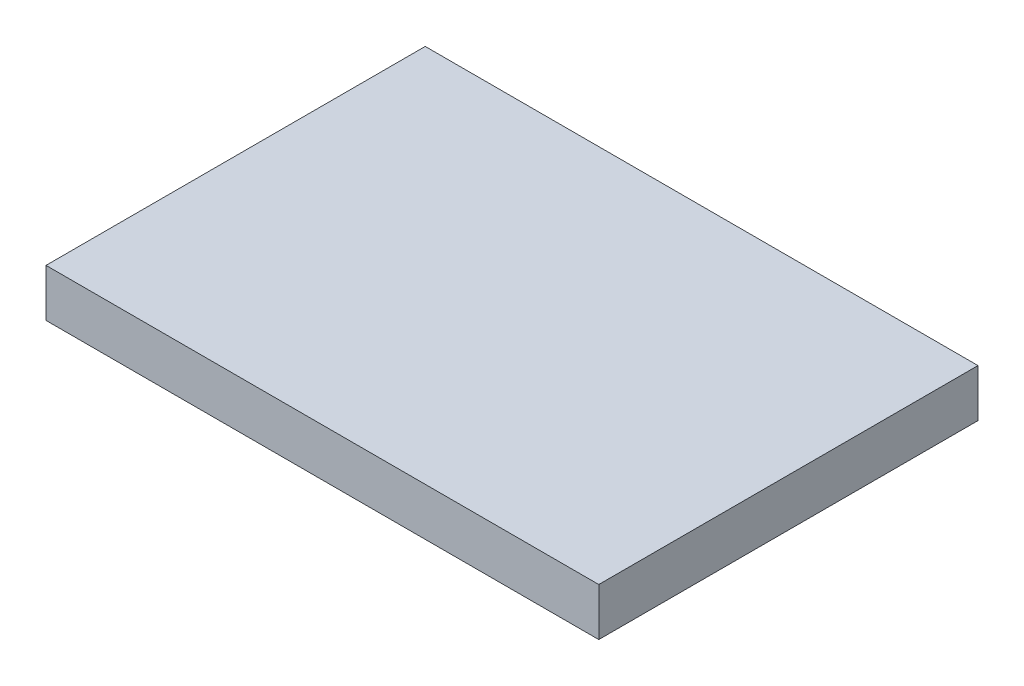
ISO-10303-21;
HEADER;
FILE_DESCRIPTION(('STEP AP214'),'2;1');
FILE_NAME('part.step','',(''),(''),'','','');
FILE_SCHEMA(('AUTOMOTIVE_DESIGN { 1 0 10303 214 1 1 1 1 }'));
ENDSEC;
DATA;
#1=APPLICATION_CONTEXT('core data for automotive mechanical design processes');
#2=APPLICATION_PROTOCOL_DEFINITION('international standard','automotive_design',2000,#1);
#3=PRODUCT_CONTEXT('',#1,'mechanical');
#4=PRODUCT('Part','Part','',(#3));
#5=PRODUCT_RELATED_PRODUCT_CATEGORY('part','',(#4));
#6=PRODUCT_DEFINITION_FORMATION('','',#4);
#7=PRODUCT_DEFINITION_CONTEXT('part definition',#1,'design');
#8=PRODUCT_DEFINITION('design','',#6,#7);
#9=PRODUCT_DEFINITION_SHAPE('','',#8);
#10=(LENGTH_UNIT() NAMED_UNIT(*) SI_UNIT(.MILLI.,.METRE.));
#11=(NAMED_UNIT(*) PLANE_ANGLE_UNIT() SI_UNIT($,.RADIAN.));
#12=(NAMED_UNIT(*) SI_UNIT($,.STERADIAN.) SOLID_ANGLE_UNIT());
#13=UNCERTAINTY_MEASURE_WITH_UNIT(LENGTH_MEASURE(1.E-05),#10,'distance_accuracy_value','');
#14=(GEOMETRIC_REPRESENTATION_CONTEXT(3) GLOBAL_UNCERTAINTY_ASSIGNED_CONTEXT((#13)) GLOBAL_UNIT_ASSIGNED_CONTEXT((#10,
#11,#12)) REPRESENTATION_CONTEXT('',''));
#15=CARTESIAN_POINT('',(0.,0.,0.));
#16=DIRECTION('',(0.,0.,1.));
#17=DIRECTION('',(1.,0.,0.));
#18=AXIS2_PLACEMENT_3D('',#15,#16,#17);
#19=CARTESIAN_POINT('',(0.,12.7,0.));
#20=DIRECTION('',(1.,0.,0.));
#21=DIRECTION('',(0.,0.,-1.));
#22=AXIS2_PLACEMENT_3D('',#19,#20,#21);
#23=PLANE('',#22);
#24=DIRECTION('',(0.,0.,1.));
#25=VECTOR('',#24,1.);
#26=CARTESIAN_POINT('',(0.,0.,0.));
#27=LINE('',#26,#25);
#28=CARTESIAN_POINT('',(0.,0.,-100.979479207466));
#29=VERTEX_POINT('',#28);
#30=CARTESIAN_POINT('',(0.,0.,0.));
#31=VERTEX_POINT('',#30);
#32=EDGE_CURVE('E94',#29,#31,#27,.T.);
#33=ORIENTED_EDGE('',*,*,#32,.T.);
#34=DIRECTION('',(0.,-1.,0.));
#35=VECTOR('',#34,1.);
#36=CARTESIAN_POINT('',(0.,12.7,0.));
#37=LINE('',#36,#35);
#38=CARTESIAN_POINT('',(0.,12.7,0.));
#39=VERTEX_POINT('',#38);
#40=EDGE_CURVE('E11',#39,#31,#37,.T.);
#41=ORIENTED_EDGE('',*,*,#40,.F.);
#42=DIRECTION('',(0.,0.,1.));
#43=VECTOR('',#42,1.);
#44=CARTESIAN_POINT('',(0.,12.7,0.));
#45=LINE('',#44,#43);
#46=CARTESIAN_POINT('',(0.,12.7,-100.979479207466));
#47=VERTEX_POINT('',#46);
#48=EDGE_CURVE('E82',#47,#39,#45,.T.);
#49=ORIENTED_EDGE('',*,*,#48,.F.);
#50=DIRECTION('',(0.,-1.,0.));
#51=VECTOR('',#50,1.);
#52=CARTESIAN_POINT('',(0.,12.7,-100.979479207466));
#53=LINE('',#52,#51);
#54=EDGE_CURVE('E90',#47,#29,#53,.T.);
#55=ORIENTED_EDGE('',*,*,#54,.T.);
#56=EDGE_LOOP('',(#33,#41,#49,#55));
#57=FACE_BOUND('',#56,.T.);
#58=ADVANCED_FACE('F31',(#57),#23,.F.);
#59=CARTESIAN_POINT('',(0.,12.7,0.));
#60=DIRECTION('',(0.,0.,-1.));
#61=DIRECTION('',(-1.,0.,0.));
#62=AXIS2_PLACEMENT_3D('',#59,#60,#61);
#63=PLANE('',#62);
#64=DIRECTION('',(1.,0.,0.));
#65=VECTOR('',#64,1.);
#66=CARTESIAN_POINT('',(0.,0.,0.));
#67=LINE('',#66,#65);
#68=CARTESIAN_POINT('',(147.191865543677,0.,0.));
#69=VERTEX_POINT('',#68);
#70=EDGE_CURVE('E86',#31,#69,#67,.T.);
#71=ORIENTED_EDGE('',*,*,#70,.T.);
#72=DIRECTION('',(0.,-1.,0.));
#73=VECTOR('',#72,1.);
#74=CARTESIAN_POINT('',(147.191865543677,12.7,0.));
#75=LINE('',#74,#73);
#76=CARTESIAN_POINT('',(147.191865543677,12.7,0.));
#77=VERTEX_POINT('',#76);
#78=EDGE_CURVE('E39',#77,#69,#75,.T.);
#79=ORIENTED_EDGE('',*,*,#78,.F.);
#80=DIRECTION('',(1.,0.,0.));
#81=VECTOR('',#80,1.);
#82=CARTESIAN_POINT('',(0.,12.7,0.));
#83=LINE('',#82,#81);
#84=EDGE_CURVE('E77',#39,#77,#83,.T.);
#85=ORIENTED_EDGE('',*,*,#84,.F.);
#86=ORIENTED_EDGE('',*,*,#40,.T.);
#87=EDGE_LOOP('',(#71,#79,#85,#86));
#88=FACE_BOUND('',#87,.T.);
#89=ADVANCED_FACE('F85',(#88),#63,.F.);
#90=CARTESIAN_POINT('',(147.191865543677,12.7,0.));
#91=DIRECTION('',(-1.,0.,0.));
#92=DIRECTION('',(0.,0.,1.));
#93=AXIS2_PLACEMENT_3D('',#90,#91,#92);
#94=PLANE('',#93);
#95=DIRECTION('',(0.,0.,-1.));
#96=VECTOR('',#95,1.);
#97=CARTESIAN_POINT('',(147.191865543677,0.,0.));
#98=LINE('',#97,#96);
#99=CARTESIAN_POINT('',(147.191865543677,0.,-100.979479207466));
#100=VERTEX_POINT('',#99);
#101=EDGE_CURVE('E64',#69,#100,#98,.T.);
#102=ORIENTED_EDGE('',*,*,#101,.T.);
#103=DIRECTION('',(0.,-1.,0.));
#104=VECTOR('',#103,1.);
#105=CARTESIAN_POINT('',(147.191865543677,12.7,-100.979479207466));
#106=LINE('',#105,#104);
#107=CARTESIAN_POINT('',(147.191865543677,12.7,-100.979479207466));
#108=VERTEX_POINT('',#107);
#109=EDGE_CURVE('E87',#108,#100,#106,.T.);
#110=ORIENTED_EDGE('',*,*,#109,.F.);
#111=DIRECTION('',(0.,0.,-1.));
#112=VECTOR('',#111,1.);
#113=CARTESIAN_POINT('',(147.191865543677,12.7,0.));
#114=LINE('',#113,#112);
#115=EDGE_CURVE('E80',#77,#108,#114,.T.);
#116=ORIENTED_EDGE('',*,*,#115,.F.);
#117=ORIENTED_EDGE('',*,*,#78,.T.);
#118=EDGE_LOOP('',(#102,#110,#116,#117));
#119=FACE_BOUND('',#118,.T.);
#120=ADVANCED_FACE('F88',(#119),#94,.F.);
#121=CARTESIAN_POINT('',(0.,12.7,-100.979479207466));
#122=DIRECTION('',(0.,0.,1.));
#123=DIRECTION('',(1.,0.,0.));
#124=AXIS2_PLACEMENT_3D('',#121,#122,#123);
#125=PLANE('',#124);
#126=DIRECTION('',(-1.,0.,0.));
#127=VECTOR('',#126,1.);
#128=CARTESIAN_POINT('',(0.,0.,-100.979479207466));
#129=LINE('',#128,#127);
#130=EDGE_CURVE('E70',#100,#29,#129,.T.);
#131=ORIENTED_EDGE('',*,*,#130,.T.);
#132=ORIENTED_EDGE('',*,*,#54,.F.);
#133=DIRECTION('',(-1.,0.,0.));
#134=VECTOR('',#133,1.);
#135=CARTESIAN_POINT('',(0.,12.7,-100.979479207466));
#136=LINE('',#135,#134);
#137=EDGE_CURVE('E47',#108,#47,#136,.T.);
#138=ORIENTED_EDGE('',*,*,#137,.F.);
#139=ORIENTED_EDGE('',*,*,#109,.T.);
#140=EDGE_LOOP('',(#131,#132,#138,#139));
#141=FACE_BOUND('',#140,.T.);
#142=ADVANCED_FACE('F101',(#141),#125,.F.);
#143=CARTESIAN_POINT('',(0.,12.7,-100.979479207466));
#144=DIRECTION('',(0.,-1.,0.));
#145=DIRECTION('',(0.,0.,-1.));
#146=AXIS2_PLACEMENT_3D('',#143,#144,#145);
#147=PLANE('',#146);
#148=ORIENTED_EDGE('',*,*,#48,.T.);
#149=ORIENTED_EDGE('',*,*,#84,.T.);
#150=ORIENTED_EDGE('',*,*,#115,.T.);
#151=ORIENTED_EDGE('',*,*,#137,.T.);
#152=EDGE_LOOP('',(#148,#149,#150,#151));
#153=FACE_BOUND('',#152,.T.);
#154=ADVANCED_FACE('F78',(#153),#147,.F.);
#155=CARTESIAN_POINT('',(0.,0.,-100.979479207466));
#156=DIRECTION('',(0.,-1.,0.));
#157=DIRECTION('',(0.,0.,-1.));
#158=AXIS2_PLACEMENT_3D('',#155,#156,#157);
#159=PLANE('',#158);
#160=ORIENTED_EDGE('',*,*,#32,.F.);
#161=ORIENTED_EDGE('',*,*,#130,.F.);
#162=ORIENTED_EDGE('',*,*,#101,.F.);
#163=ORIENTED_EDGE('',*,*,#70,.F.);
#164=EDGE_LOOP('',(#160,#161,#162,#163));
#165=FACE_BOUND('',#164,.T.);
#166=ADVANCED_FACE('F104',(#165),#159,.T.);
#167=CLOSED_SHELL('',(#58,#89,#120,#142,#154,#166));
#168=MANIFOLD_SOLID_BREP('B2',#167);
#169=ADVANCED_BREP_SHAPE_REPRESENTATION('',(#18,#168),#14);
#170=SHAPE_DEFINITION_REPRESENTATION(#9,#169);
ENDSEC;
END-ISO-10303-21;
